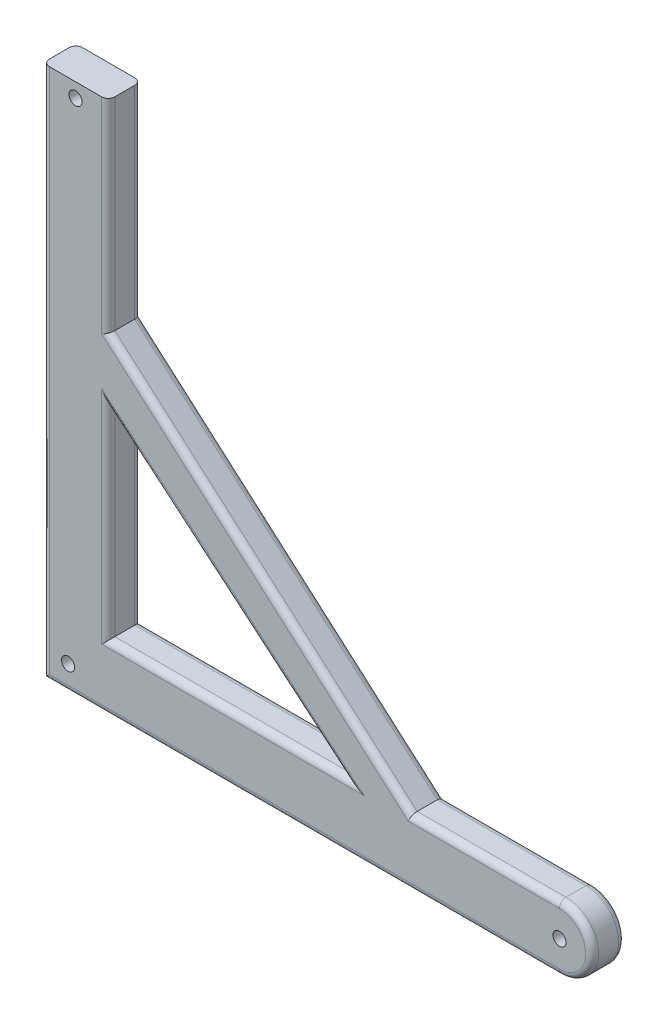
ISO-10303-21;
HEADER;
FILE_DESCRIPTION(('STEP AP214'),'2;1');
FILE_NAME('part.step','',(''),(''),'','','');
FILE_SCHEMA(('AUTOMOTIVE_DESIGN { 1 0 10303 214 1 1 1 1 }'));
ENDSEC;
DATA;
#1=APPLICATION_CONTEXT('core data for automotive mechanical design processes');
#2=APPLICATION_PROTOCOL_DEFINITION('international standard','automotive_design',2000,#1);
#3=PRODUCT_CONTEXT('',#1,'mechanical');
#4=PRODUCT('Part','Part','',(#3));
#5=PRODUCT_RELATED_PRODUCT_CATEGORY('part','',(#4));
#6=PRODUCT_DEFINITION_FORMATION('','',#4);
#7=PRODUCT_DEFINITION_CONTEXT('part definition',#1,'design');
#8=PRODUCT_DEFINITION('design','',#6,#7);
#9=PRODUCT_DEFINITION_SHAPE('','',#8);
#10=(LENGTH_UNIT() NAMED_UNIT(*) SI_UNIT(.MILLI.,.METRE.));
#11=(NAMED_UNIT(*) PLANE_ANGLE_UNIT() SI_UNIT($,.RADIAN.));
#12=(NAMED_UNIT(*) SI_UNIT($,.STERADIAN.) SOLID_ANGLE_UNIT());
#13=UNCERTAINTY_MEASURE_WITH_UNIT(LENGTH_MEASURE(1.E-05),#10,'distance_accuracy_value','');
#14=(GEOMETRIC_REPRESENTATION_CONTEXT(3) GLOBAL_UNCERTAINTY_ASSIGNED_CONTEXT((#13)) GLOBAL_UNIT_ASSIGNED_CONTEXT((#10,
#11,#12)) REPRESENTATION_CONTEXT('',''));
#15=CARTESIAN_POINT('',(0.,0.,0.));
#16=DIRECTION('',(0.,0.,1.));
#17=DIRECTION('',(1.,0.,0.));
#18=AXIS2_PLACEMENT_3D('',#15,#16,#17);
#19=CARTESIAN_POINT('',(130.379626457664,-10.,10.1));
#20=DIRECTION('',(0.,0.,-1.));
#21=DIRECTION('',(-1.,0.,0.));
#22=AXIS2_PLACEMENT_3D('',#19,#20,#21);
#23=CYLINDRICAL_SURFACE('',#22,10.);
#24=DIRECTION('',(0.,0.,-1.));
#25=VECTOR('',#24,1.);
#26=CARTESIAN_POINT('',(130.379626457664,-20.,10.1));
#27=LINE('',#26,#25);
#28=CARTESIAN_POINT('',(130.379626457664,-20.,8.1));
#29=VERTEX_POINT('',#28);
#30=CARTESIAN_POINT('',(130.379626457664,-20.,2.));
#31=VERTEX_POINT('',#30);
#32=EDGE_CURVE('E206',#29,#31,#27,.T.);
#33=ORIENTED_EDGE('',*,*,#32,.T.);
#34=CARTESIAN_POINT('',(130.379626457664,-10.,2.));
#35=DIRECTION('',(0.,0.,1.));
#36=DIRECTION('',(1.,0.,0.));
#37=AXIS2_PLACEMENT_3D('',#34,#35,#36);
#38=CIRCLE('',#37,10.);
#39=CARTESIAN_POINT('',(130.379626457664,0.,2.));
#40=VERTEX_POINT('',#39);
#41=EDGE_CURVE('E204',#31,#40,#38,.T.);
#42=ORIENTED_EDGE('',*,*,#41,.T.);
#43=DIRECTION('',(0.,0.,-1.));
#44=VECTOR('',#43,1.);
#45=CARTESIAN_POINT('',(130.379626457664,0.,10.1));
#46=LINE('',#45,#44);
#47=CARTESIAN_POINT('',(130.379626457664,0.,8.1));
#48=VERTEX_POINT('',#47);
#49=EDGE_CURVE('E188',#48,#40,#46,.T.);
#50=ORIENTED_EDGE('',*,*,#49,.F.);
#51=CARTESIAN_POINT('',(130.379626457664,-10.,8.1));
#52=DIRECTION('',(0.,0.,1.));
#53=DIRECTION('',(1.,0.,0.));
#54=AXIS2_PLACEMENT_3D('',#51,#52,#53);
#55=CIRCLE('',#54,10.);
#56=EDGE_CURVE('E201',#48,#29,#55,.F.);
#57=ORIENTED_EDGE('',*,*,#56,.T.);
#58=EDGE_LOOP('',(#33,#42,#50,#57));
#59=FACE_BOUND('',#58,.T.);
#60=ADVANCED_FACE('F47',(#59),#23,.T.);
#61=CARTESIAN_POINT('',(84.8796264576637,0.,10.1));
#62=DIRECTION('',(0.,-1.,0.));
#63=DIRECTION('',(0.,0.,-1.));
#64=AXIS2_PLACEMENT_3D('',#61,#62,#63);
#65=PLANE('',#64);
#66=ORIENTED_EDGE('',*,*,#49,.T.);
#67=DIRECTION('',(-1.,0.,0.));
#68=VECTOR('',#67,1.);
#69=CARTESIAN_POINT('',(84.8796264576637,0.,2.));
#70=LINE('',#69,#68);
#71=CARTESIAN_POINT('',(84.8796264576637,0.,2.));
#72=VERTEX_POINT('',#71);
#73=EDGE_CURVE('E65',#40,#72,#70,.T.);
#74=ORIENTED_EDGE('',*,*,#73,.T.);
#75=DIRECTION('',(0.,0.,-1.));
#76=VECTOR('',#75,1.);
#77=CARTESIAN_POINT('',(84.8796264576637,0.,10.1));
#78=LINE('',#77,#76);
#79=CARTESIAN_POINT('',(84.8796264576637,0.,8.1));
#80=VERTEX_POINT('',#79);
#81=EDGE_CURVE('E189',#80,#72,#78,.T.);
#82=ORIENTED_EDGE('',*,*,#81,.F.);
#83=DIRECTION('',(-1.,0.,0.));
#84=VECTOR('',#83,1.);
#85=CARTESIAN_POINT('',(130.379626457664,0.,8.1));
#86=LINE('',#85,#84);
#87=EDGE_CURVE('E185',#80,#48,#86,.F.);
#88=ORIENTED_EDGE('',*,*,#87,.T.);
#89=EDGE_LOOP('',(#66,#74,#82,#88));
#90=FACE_BOUND('',#89,.T.);
#91=ADVANCED_FACE('F187',(#90),#65,.F.);
#92=CARTESIAN_POINT('',(-7.62037354233634,81.0724984196244,10.1));
#93=DIRECTION('',(-0.659126003411581,-0.752032520325203,0.));
#94=DIRECTION('',(0.752032520325203,-0.659126003411581,0.));
#95=AXIS2_PLACEMENT_3D('',#92,#93,#94);
#96=PLANE('',#95);
#97=ORIENTED_EDGE('',*,*,#81,.T.);
#98=DIRECTION('',(-0.752032520325203,0.659126003411581,0.));
#99=VECTOR('',#98,1.);
#100=CARTESIAN_POINT('',(-7.62037354233634,81.0724984196244,2.));
#101=LINE('',#100,#99);
#102=CARTESIAN_POINT('',(-7.62037354233634,81.0724984196244,2.));
#103=VERTEX_POINT('',#102);
#104=EDGE_CURVE('E11',#72,#103,#101,.T.);
#105=ORIENTED_EDGE('',*,*,#104,.T.);
#106=DIRECTION('',(0.,0.,-1.));
#107=VECTOR('',#106,1.);
#108=CARTESIAN_POINT('',(-7.62037354233634,81.0724984196244,10.1));
#109=LINE('',#108,#107);
#110=CARTESIAN_POINT('',(-7.62037354233634,81.0724984196244,8.1));
#111=VERTEX_POINT('',#110);
#112=EDGE_CURVE('E421',#111,#103,#109,.T.);
#113=ORIENTED_EDGE('',*,*,#112,.F.);
#114=DIRECTION('',(-0.752032520325203,0.659126003411581,0.));
#115=VECTOR('',#114,1.);
#116=CARTESIAN_POINT('',(84.8796264576636,0.,8.1));
#117=LINE('',#116,#115);
#118=EDGE_CURVE('E57',#111,#80,#117,.F.);
#119=ORIENTED_EDGE('',*,*,#118,.T.);
#120=EDGE_LOOP('',(#97,#105,#113,#119));
#121=FACE_BOUND('',#120,.T.);
#122=ADVANCED_FACE('F499',(#121),#96,.F.);
#123=CARTESIAN_POINT('',(-7.62037354233634,81.0724984196244,10.1));
#124=DIRECTION('',(-1.,0.,0.));
#125=DIRECTION('',(0.,-1.,0.));
#126=AXIS2_PLACEMENT_3D('',#123,#124,#125);
#127=PLANE('',#126);
#128=ORIENTED_EDGE('',*,*,#112,.T.);
#129=DIRECTION('',(0.,1.,0.));
#130=VECTOR('',#129,1.);
#131=CARTESIAN_POINT('',(-7.62037354233634,81.0724984196244,2.));
#132=LINE('',#131,#130);
#133=CARTESIAN_POINT('',(-7.62037354233634,143.,2.));
#134=VERTEX_POINT('',#133);
#135=EDGE_CURVE('E318',#103,#134,#132,.T.);
#136=ORIENTED_EDGE('',*,*,#135,.T.);
#137=DIRECTION('',(0.,0.,-1.));
#138=VECTOR('',#137,1.);
#139=CARTESIAN_POINT('',(-7.62037354233634,143.,10.1));
#140=LINE('',#139,#138);
#141=CARTESIAN_POINT('',(-7.62037354233634,143.,8.1));
#142=VERTEX_POINT('',#141);
#143=EDGE_CURVE('E417',#142,#134,#140,.T.);
#144=ORIENTED_EDGE('',*,*,#143,.F.);
#145=DIRECTION('',(0.,1.,0.));
#146=VECTOR('',#145,1.);
#147=CARTESIAN_POINT('',(-7.62037354233634,81.0724984196244,8.1));
#148=LINE('',#147,#146);
#149=EDGE_CURVE('E315',#142,#111,#148,.F.);
#150=ORIENTED_EDGE('',*,*,#149,.T.);
#151=EDGE_LOOP('',(#128,#136,#144,#150));
#152=FACE_BOUND('',#151,.T.);
#153=ADVANCED_FACE('F738',(#152),#127,.F.);
#154=CARTESIAN_POINT('',(-7.62037354233634,143.,10.1));
#155=DIRECTION('',(0.,-1.,0.));
#156=DIRECTION('',(0.,0.,-1.));
#157=AXIS2_PLACEMENT_3D('',#154,#155,#156);
#158=PLANE('',#157);
#159=ORIENTED_EDGE('',*,*,#143,.T.);
#160=CARTESIAN_POINT('',(-9.62037354233634,143.,2.));
#161=DIRECTION('',(0.,-1.,0.));
#162=DIRECTION('',(0.,0.,-1.));
#163=AXIS2_PLACEMENT_3D('',#160,#161,#162);
#164=CIRCLE('',#163,2.);
#165=CARTESIAN_POINT('',(-9.62037354233634,143.,0.));
#166=VERTEX_POINT('',#165);
#167=EDGE_CURVE('E330',#134,#166,#164,.F.);
#168=ORIENTED_EDGE('',*,*,#167,.T.);
#169=DIRECTION('',(-1.,0.,0.));
#170=VECTOR('',#169,1.);
#171=CARTESIAN_POINT('',(-7.62037354233634,143.,0.));
#172=LINE('',#171,#170);
#173=CARTESIAN_POINT('',(-25.6203735423363,143.,0.));
#174=VERTEX_POINT('',#173);
#175=EDGE_CURVE('E406',#166,#174,#172,.T.);
#176=ORIENTED_EDGE('',*,*,#175,.T.);
#177=CARTESIAN_POINT('',(-25.6203735423363,143.,2.));
#178=DIRECTION('',(0.,-1.,0.));
#179=DIRECTION('',(0.,0.,-1.));
#180=AXIS2_PLACEMENT_3D('',#177,#178,#179);
#181=CIRCLE('',#180,2.);
#182=CARTESIAN_POINT('',(-27.6203735423363,143.,2.));
#183=VERTEX_POINT('',#182);
#184=EDGE_CURVE('E321',#174,#183,#181,.F.);
#185=ORIENTED_EDGE('',*,*,#184,.T.);
#186=DIRECTION('',(0.,0.,-1.));
#187=VECTOR('',#186,1.);
#188=CARTESIAN_POINT('',(-27.6203735423363,143.,10.1));
#189=LINE('',#188,#187);
#190=CARTESIAN_POINT('',(-27.6203735423363,143.,8.1));
#191=VERTEX_POINT('',#190);
#192=EDGE_CURVE('E413',#191,#183,#189,.T.);
#193=ORIENTED_EDGE('',*,*,#192,.F.);
#194=CARTESIAN_POINT('',(-25.6203735423363,143.,8.1));
#195=DIRECTION('',(0.,-1.,0.));
#196=DIRECTION('',(0.,0.,-1.));
#197=AXIS2_PLACEMENT_3D('',#194,#195,#196);
#198=CIRCLE('',#197,2.);
#199=CARTESIAN_POINT('',(-25.6203735423363,143.,10.1));
#200=VERTEX_POINT('',#199);
#201=EDGE_CURVE('E324',#191,#200,#198,.F.);
#202=ORIENTED_EDGE('',*,*,#201,.T.);
#203=DIRECTION('',(-1.,0.,0.));
#204=VECTOR('',#203,1.);
#205=CARTESIAN_POINT('',(-7.62037354233634,143.,10.1));
#206=LINE('',#205,#204);
#207=CARTESIAN_POINT('',(-9.62037354233632,143.,10.1));
#208=VERTEX_POINT('',#207);
#209=EDGE_CURVE('E401',#208,#200,#206,.T.);
#210=ORIENTED_EDGE('',*,*,#209,.F.);
#211=CARTESIAN_POINT('',(-9.62037354233632,143.,8.1));
#212=DIRECTION('',(0.,-1.,0.));
#213=DIRECTION('',(0.,0.,-1.));
#214=AXIS2_PLACEMENT_3D('',#211,#212,#213);
#215=CIRCLE('',#214,2.);
#216=EDGE_CURVE('E327',#208,#142,#215,.F.);
#217=ORIENTED_EDGE('',*,*,#216,.T.);
#218=EDGE_LOOP('',(#159,#168,#176,#185,#193,#202,#210,#217));
#219=FACE_BOUND('',#218,.T.);
#220=ADVANCED_FACE('F454',(#219),#158,.F.);
#221=CARTESIAN_POINT('',(-27.6203735423363,-20.,10.1));
#222=DIRECTION('',(1.,0.,0.));
#223=DIRECTION('',(0.,0.,-1.));
#224=AXIS2_PLACEMENT_3D('',#221,#222,#223);
#225=PLANE('',#224);
#226=DIRECTION('',(0.,0.,-1.));
#227=VECTOR('',#226,1.);
#228=CARTESIAN_POINT('',(-27.6203735423363,-20.,10.1));
#229=LINE('',#228,#227);
#230=CARTESIAN_POINT('',(-27.6203735423363,-20.,8.1));
#231=VERTEX_POINT('',#230);
#232=CARTESIAN_POINT('',(-27.6203735423363,-20.,2.));
#233=VERTEX_POINT('',#232);
#234=EDGE_CURVE('E405',#231,#233,#229,.T.);
#235=ORIENTED_EDGE('',*,*,#234,.F.);
#236=DIRECTION('',(0.,-1.,0.));
#237=VECTOR('',#236,1.);
#238=CARTESIAN_POINT('',(-27.6203735423363,143.,8.1));
#239=LINE('',#238,#237);
#240=EDGE_CURVE('E336',#231,#191,#239,.F.);
#241=ORIENTED_EDGE('',*,*,#240,.T.);
#242=ORIENTED_EDGE('',*,*,#192,.T.);
#243=DIRECTION('',(0.,-1.,0.));
#244=VECTOR('',#243,1.);
#245=CARTESIAN_POINT('',(-27.6203735423363,-20.,2.));
#246=LINE('',#245,#244);
#247=EDGE_CURVE('E333',#183,#233,#246,.T.);
#248=ORIENTED_EDGE('',*,*,#247,.T.);
#249=EDGE_LOOP('',(#235,#241,#242,#248));
#250=FACE_BOUND('',#249,.T.);
#251=ADVANCED_FACE('F461',(#250),#225,.F.);
#252=CARTESIAN_POINT('',(84.8796264576637,-20.,10.1));
#253=DIRECTION('',(0.,1.,0.));
#254=DIRECTION('',(-1.,0.,0.));
#255=AXIS2_PLACEMENT_3D('',#252,#253,#254);
#256=PLANE('',#255);
#257=ORIENTED_EDGE('',*,*,#234,.T.);
#258=DIRECTION('',(1.,0.,0.));
#259=VECTOR('',#258,1.);
#260=CARTESIAN_POINT('',(84.8796264576637,-20.,2.));
#261=LINE('',#260,#259);
#262=EDGE_CURVE('E342',#233,#31,#261,.T.);
#263=ORIENTED_EDGE('',*,*,#262,.T.);
#264=ORIENTED_EDGE('',*,*,#32,.F.);
#265=DIRECTION('',(1.,0.,0.));
#266=VECTOR('',#265,1.);
#267=CARTESIAN_POINT('',(-27.6203735423363,-20.,8.1));
#268=LINE('',#267,#266);
#269=EDGE_CURVE('E339',#29,#231,#268,.F.);
#270=ORIENTED_EDGE('',*,*,#269,.T.);
#271=EDGE_LOOP('',(#257,#263,#264,#270));
#272=FACE_BOUND('',#271,.T.);
#273=ADVANCED_FACE('F464',(#272),#256,.F.);
#274=CARTESIAN_POINT('',(130.379626457664,-10.,10.1));
#275=DIRECTION('',(0.,0.,1.));
#276=DIRECTION('',(1.,0.,0.));
#277=AXIS2_PLACEMENT_3D('',#274,#275,#276);
#278=PLANE('',#277);
#279=CARTESIAN_POINT('',(130.379626457664,-10.,10.1));
#280=DIRECTION('',(0.,0.,1.));
#281=DIRECTION('',(1.,0.,0.));
#282=AXIS2_PLACEMENT_3D('',#279,#280,#281);
#283=CIRCLE('',#282,2.);
#284=CARTESIAN_POINT('',(132.379626457664,-10.,10.1));
#285=VERTEX_POINT('',#284);
#286=EDGE_CURVE('E813',#285,#285,#283,.T.);
#287=ORIENTED_EDGE('',*,*,#286,.F.);
#288=EDGE_LOOP('',(#287));
#289=FACE_BOUND('',#288,.T.);
#290=CARTESIAN_POINT('',(-19.903008844991,-12.2826353026546,10.1));
#291=DIRECTION('',(0.,0.,1.));
#292=DIRECTION('',(1.,0.,0.));
#293=AXIS2_PLACEMENT_3D('',#290,#291,#292);
#294=CIRCLE('',#293,2.);
#295=CARTESIAN_POINT('',(-17.9030088449909,-12.2826353026546,10.1));
#296=VERTEX_POINT('',#295);
#297=EDGE_CURVE('E809',#296,#296,#294,.T.);
#298=ORIENTED_EDGE('',*,*,#297,.F.);
#299=EDGE_LOOP('',(#298));
#300=FACE_BOUND('',#299,.T.);
#301=CARTESIAN_POINT('',(-17.6203735423363,138.6375916414,10.1));
#302=DIRECTION('',(0.,0.,1.));
#303=DIRECTION('',(1.,0.,0.));
#304=AXIS2_PLACEMENT_3D('',#301,#302,#303);
#305=CIRCLE('',#304,2.);
#306=CARTESIAN_POINT('',(-15.6203735423363,138.6375916414,10.1));
#307=VERTEX_POINT('',#306);
#308=EDGE_CURVE('E801',#307,#307,#305,.T.);
#309=ORIENTED_EDGE('',*,*,#308,.F.);
#310=EDGE_LOOP('',(#309));
#311=FACE_BOUND('',#310,.T.);
#312=DIRECTION('',(0.,-1.,0.));
#313=VECTOR('',#312,1.);
#314=CARTESIAN_POINT('',(-9.62037354233634,61.4624984196244,10.1));
#315=LINE('',#314,#313);
#316=CARTESIAN_POINT('',(-9.62037354233633,-2.,10.1));
#317=VERTEX_POINT('',#316);
#318=CARTESIAN_POINT('',(-9.62037354233634,65.7650663510499,10.1));
#319=VERTEX_POINT('',#318);
#320=EDGE_CURVE('E305',#317,#319,#315,.F.);
#321=ORIENTED_EDGE('',*,*,#320,.T.);
#322=DIRECTION('',(0.764490152209144,-0.644635406392823,0.));
#323=VECTOR('',#322,1.);
#324=CARTESIAN_POINT('',(109.540297974796,-34.7139099804514,10.1));
#325=LINE('',#324,#323);
#326=CARTESIAN_POINT('',(70.7440082080632,-2.,10.1));
#327=VERTEX_POINT('',#326);
#328=EDGE_CURVE('E311',#319,#327,#325,.T.);
#329=ORIENTED_EDGE('',*,*,#328,.T.);
#330=DIRECTION('',(1.,0.,0.));
#331=VECTOR('',#330,1.);
#332=CARTESIAN_POINT('',(-7.62037354233633,-2.,10.1));
#333=LINE('',#332,#331);
#334=EDGE_CURVE('E308',#327,#317,#333,.F.);
#335=ORIENTED_EDGE('',*,*,#334,.T.);
#336=EDGE_LOOP('',(#321,#329,#335));
#337=FACE_BOUND('',#336,.T.);
#338=ORIENTED_EDGE('',*,*,#209,.T.);
#339=DIRECTION('',(0.,-1.,0.));
#340=VECTOR('',#339,1.);
#341=CARTESIAN_POINT('',(-25.6203735423363,-20.,10.1));
#342=LINE('',#341,#340);
#343=CARTESIAN_POINT('',(-25.6203735423363,-18.,10.1));
#344=VERTEX_POINT('',#343);
#345=EDGE_CURVE('E302',#200,#344,#342,.T.);
#346=ORIENTED_EDGE('',*,*,#345,.T.);
#347=DIRECTION('',(1.,0.,0.));
#348=VECTOR('',#347,1.);
#349=CARTESIAN_POINT('',(130.379626457664,-18.,10.1));
#350=LINE('',#349,#348);
#351=CARTESIAN_POINT('',(130.379626457664,-18.,10.1));
#352=VERTEX_POINT('',#351);
#353=EDGE_CURVE('E299',#344,#352,#350,.T.);
#354=ORIENTED_EDGE('',*,*,#353,.T.);
#355=CARTESIAN_POINT('',(130.379626457664,-10.,10.1));
#356=DIRECTION('',(0.,0.,1.));
#357=DIRECTION('',(1.,0.,0.));
#358=AXIS2_PLACEMENT_3D('',#355,#356,#357);
#359=CIRCLE('',#358,8.);
#360=CARTESIAN_POINT('',(130.379626457664,-2.,10.1));
#361=VERTEX_POINT('',#360);
#362=EDGE_CURVE('E296',#352,#361,#359,.T.);
#363=ORIENTED_EDGE('',*,*,#362,.T.);
#364=DIRECTION('',(-1.,0.,0.));
#365=VECTOR('',#364,1.);
#366=CARTESIAN_POINT('',(84.8796264576637,-2.,10.1));
#367=LINE('',#366,#365);
#368=CARTESIAN_POINT('',(84.1272134792912,-2.,10.1));
#369=VERTEX_POINT('',#368);
#370=EDGE_CURVE('E219',#361,#369,#367,.T.);
#371=ORIENTED_EDGE('',*,*,#370,.T.);
#372=DIRECTION('',(-0.752032520325203,0.659126003411581,0.));
#373=VECTOR('',#372,1.);
#374=CARTESIAN_POINT('',(-8.93862554915954,79.568433378974,10.1));
#375=LINE('',#374,#373);
#376=CARTESIAN_POINT('',(-9.62037354233632,80.1659578449135,10.1));
#377=VERTEX_POINT('',#376);
#378=EDGE_CURVE('E283',#369,#377,#375,.T.);
#379=ORIENTED_EDGE('',*,*,#378,.T.);
#380=DIRECTION('',(0.,1.,0.));
#381=VECTOR('',#380,1.);
#382=CARTESIAN_POINT('',(-9.62037354233632,143.,10.1));
#383=LINE('',#382,#381);
#384=EDGE_CURVE('E293',#377,#208,#383,.T.);
#385=ORIENTED_EDGE('',*,*,#384,.T.);
#386=EDGE_LOOP('',(#338,#346,#354,#363,#371,#379,#385));
#387=FACE_BOUND('',#386,.T.);
#388=ADVANCED_FACE('F477',(#289,#300,#311,#337,#387),#278,.T.);
#389=CARTESIAN_POINT('',(130.379626457664,-10.,0.));
#390=DIRECTION('',(0.,0.,1.));
#391=DIRECTION('',(1.,0.,0.));
#392=AXIS2_PLACEMENT_3D('',#389,#390,#391);
#393=PLANE('',#392);
#394=CARTESIAN_POINT('',(130.379626457664,-10.,0.));
#395=DIRECTION('',(0.,0.,1.));
#396=DIRECTION('',(1.,0.,0.));
#397=AXIS2_PLACEMENT_3D('',#394,#395,#396);
#398=CIRCLE('',#397,2.);
#399=CARTESIAN_POINT('',(132.379626457664,-10.,0.));
#400=VERTEX_POINT('',#399);
#401=EDGE_CURVE('E254',#400,#400,#398,.T.);
#402=ORIENTED_EDGE('',*,*,#401,.T.);
#403=EDGE_LOOP('',(#402));
#404=FACE_BOUND('',#403,.T.);
#405=CARTESIAN_POINT('',(-19.903008844991,-12.2826353026546,0.));
#406=DIRECTION('',(0.,0.,1.));
#407=DIRECTION('',(1.,0.,0.));
#408=AXIS2_PLACEMENT_3D('',#405,#406,#407);
#409=CIRCLE('',#408,2.);
#410=CARTESIAN_POINT('',(-17.9030088449909,-12.2826353026546,0.));
#411=VERTEX_POINT('',#410);
#412=EDGE_CURVE('E805',#411,#411,#409,.T.);
#413=ORIENTED_EDGE('',*,*,#412,.T.);
#414=EDGE_LOOP('',(#413));
#415=FACE_BOUND('',#414,.T.);
#416=CARTESIAN_POINT('',(-17.6203735423363,138.6375916414,0.));
#417=DIRECTION('',(0.,0.,1.));
#418=DIRECTION('',(1.,0.,0.));
#419=AXIS2_PLACEMENT_3D('',#416,#417,#418);
#420=CIRCLE('',#419,2.);
#421=CARTESIAN_POINT('',(-15.6203735423363,138.6375916414,0.));
#422=VERTEX_POINT('',#421);
#423=EDGE_CURVE('E797',#422,#422,#420,.T.);
#424=ORIENTED_EDGE('',*,*,#423,.T.);
#425=EDGE_LOOP('',(#424));
#426=FACE_BOUND('',#425,.T.);
#427=DIRECTION('',(0.764490152209144,-0.644635406392823,0.));
#428=VECTOR('',#427,1.);
#429=CARTESIAN_POINT('',(-6.33110272955069,62.9914787240427,0.));
#430=LINE('',#429,#428);
#431=CARTESIAN_POINT('',(70.7440082080632,-2.,0.));
#432=VERTEX_POINT('',#431);
#433=CARTESIAN_POINT('',(-9.62037354233634,65.7650663510499,0.));
#434=VERTEX_POINT('',#433);
#435=EDGE_CURVE('E276',#432,#434,#430,.F.);
#436=ORIENTED_EDGE('',*,*,#435,.T.);
#437=DIRECTION('',(0.,-1.,0.));
#438=VECTOR('',#437,1.);
#439=CARTESIAN_POINT('',(-9.62037354233633,-10.,0.));
#440=LINE('',#439,#438);
#441=CARTESIAN_POINT('',(-9.62037354233633,-2.,0.));
#442=VERTEX_POINT('',#441);
#443=EDGE_CURVE('E279',#434,#442,#440,.T.);
#444=ORIENTED_EDGE('',*,*,#443,.T.);
#445=DIRECTION('',(1.,0.,0.));
#446=VECTOR('',#445,1.);
#447=CARTESIAN_POINT('',(130.379626457664,-2.,0.));
#448=LINE('',#447,#446);
#449=EDGE_CURVE('E269',#442,#432,#448,.T.);
#450=ORIENTED_EDGE('',*,*,#449,.T.);
#451=EDGE_LOOP('',(#436,#444,#450));
#452=FACE_BOUND('',#451,.T.);
#453=DIRECTION('',(1.,0.,0.));
#454=VECTOR('',#453,1.);
#455=CARTESIAN_POINT('',(130.379626457664,-18.,0.));
#456=LINE('',#455,#454);
#457=CARTESIAN_POINT('',(130.379626457664,-18.,0.));
#458=VERTEX_POINT('',#457);
#459=CARTESIAN_POINT('',(-25.6203735423363,-18.,0.));
#460=VERTEX_POINT('',#459);
#461=EDGE_CURVE('E443',#458,#460,#456,.F.);
#462=ORIENTED_EDGE('',*,*,#461,.T.);
#463=DIRECTION('',(0.,-1.,0.));
#464=VECTOR('',#463,1.);
#465=CARTESIAN_POINT('',(-25.6203735423363,-10.,0.));
#466=LINE('',#465,#464);
#467=EDGE_CURVE('E285',#460,#174,#466,.F.);
#468=ORIENTED_EDGE('',*,*,#467,.T.);
#469=ORIENTED_EDGE('',*,*,#175,.F.);
#470=DIRECTION('',(0.,1.,0.));
#471=VECTOR('',#470,1.);
#472=CARTESIAN_POINT('',(-9.62037354233633,-9.99999999999999,0.));
#473=LINE('',#472,#471);
#474=CARTESIAN_POINT('',(-9.62037354233634,80.1659578449136,0.));
#475=VERTEX_POINT('',#474);
#476=EDGE_CURVE('E437',#166,#475,#473,.F.);
#477=ORIENTED_EDGE('',*,*,#476,.T.);
#478=DIRECTION('',(-0.752032520325203,0.659126003411581,0.));
#479=VECTOR('',#478,1.);
#480=CARTESIAN_POINT('',(114.250873825429,-28.4021665492494,0.));
#481=LINE('',#480,#479);
#482=CARTESIAN_POINT('',(84.1272134792913,-2.,0.));
#483=VERTEX_POINT('',#482);
#484=EDGE_CURVE('E431',#475,#483,#481,.F.);
#485=ORIENTED_EDGE('',*,*,#484,.T.);
#486=DIRECTION('',(-1.,0.,0.));
#487=VECTOR('',#486,1.);
#488=CARTESIAN_POINT('',(130.379626457664,-2.,0.));
#489=LINE('',#488,#487);
#490=CARTESIAN_POINT('',(130.379626457664,-2.,0.));
#491=VERTEX_POINT('',#490);
#492=EDGE_CURVE('E434',#483,#491,#489,.F.);
#493=ORIENTED_EDGE('',*,*,#492,.T.);
#494=CARTESIAN_POINT('',(130.379626457664,-10.,0.));
#495=DIRECTION('',(0.,0.,1.));
#496=DIRECTION('',(1.,0.,0.));
#497=AXIS2_PLACEMENT_3D('',#494,#495,#496);
#498=CIRCLE('',#497,8.);
#499=EDGE_CURVE('E440',#491,#458,#498,.F.);
#500=ORIENTED_EDGE('',*,*,#499,.T.);
#501=EDGE_LOOP('',(#462,#468,#469,#477,#485,#493,#500));
#502=FACE_BOUND('',#501,.T.);
#503=ADVANCED_FACE('F449',(#404,#415,#426,#452,#502),#393,.F.);
#504=CARTESIAN_POINT('',(-7.62037354233634,61.4624984196244,0.));
#505=DIRECTION('',(-1.,0.,0.));
#506=DIRECTION('',(0.,-1.,0.));
#507=AXIS2_PLACEMENT_3D('',#504,#505,#506);
#508=PLANE('',#507);
#509=DIRECTION('',(0.,0.,1.));
#510=VECTOR('',#509,1.);
#511=CARTESIAN_POINT('',(-7.62037354233634,61.4624984196244,0.));
#512=LINE('',#511,#510);
#513=CARTESIAN_POINT('',(-7.62037354233634,61.4624984196244,2.));
#514=VERTEX_POINT('',#513);
#515=CARTESIAN_POINT('',(-7.62037354233634,61.4624984196244,8.1));
#516=VERTEX_POINT('',#515);
#517=EDGE_CURVE('E397',#514,#516,#512,.T.);
#518=ORIENTED_EDGE('',*,*,#517,.T.);
#519=DIRECTION('',(0.,-1.,0.));
#520=VECTOR('',#519,1.);
#521=CARTESIAN_POINT('',(-7.62037354233633,0.,8.1));
#522=LINE('',#521,#520);
#523=CARTESIAN_POINT('',(-7.62037354233633,0.,8.1));
#524=VERTEX_POINT('',#523);
#525=EDGE_CURVE('E195',#516,#524,#522,.T.);
#526=ORIENTED_EDGE('',*,*,#525,.T.);
#527=DIRECTION('',(0.,0.,1.));
#528=VECTOR('',#527,1.);
#529=CARTESIAN_POINT('',(-7.62037354233633,0.,0.));
#530=LINE('',#529,#528);
#531=CARTESIAN_POINT('',(-7.62037354233633,0.,2.));
#532=VERTEX_POINT('',#531);
#533=EDGE_CURVE('E383',#532,#524,#530,.T.);
#534=ORIENTED_EDGE('',*,*,#533,.F.);
#535=DIRECTION('',(0.,-1.,0.));
#536=VECTOR('',#535,1.);
#537=CARTESIAN_POINT('',(-7.62037354233634,61.4624984196244,2.));
#538=LINE('',#537,#536);
#539=EDGE_CURVE('E356',#532,#514,#538,.F.);
#540=ORIENTED_EDGE('',*,*,#539,.T.);
#541=EDGE_LOOP('',(#518,#526,#534,#540));
#542=FACE_BOUND('',#541,.T.);
#543=ADVANCED_FACE('F601',(#542),#508,.F.);
#544=CARTESIAN_POINT('',(-7.62037354233634,61.4624984196244,0.));
#545=DIRECTION('',(-0.644635406392823,-0.764490152209144,0.));
#546=DIRECTION('',(0.764490152209144,-0.644635406392823,0.));
#547=AXIS2_PLACEMENT_3D('',#544,#545,#546);
#548=PLANE('',#547);
#549=DIRECTION('',(0.,0.,1.));
#550=VECTOR('',#549,1.);
#551=CARTESIAN_POINT('',(65.2696264576636,0.,0.));
#552=LINE('',#551,#550);
#553=CARTESIAN_POINT('',(65.2696264576636,0.,2.));
#554=VERTEX_POINT('',#553);
#555=CARTESIAN_POINT('',(65.2696264576636,0.,8.1));
#556=VERTEX_POINT('',#555);
#557=EDGE_CURVE('E390',#554,#556,#552,.T.);
#558=ORIENTED_EDGE('',*,*,#557,.T.);
#559=DIRECTION('',(0.764490152209144,-0.644635406392823,0.));
#560=VECTOR('',#559,1.);
#561=CARTESIAN_POINT('',(-7.62037354233634,61.4624984196244,8.1));
#562=LINE('',#561,#560);
#563=EDGE_CURVE('E347',#556,#516,#562,.F.);
#564=ORIENTED_EDGE('',*,*,#563,.T.);
#565=ORIENTED_EDGE('',*,*,#517,.F.);
#566=DIRECTION('',(0.764490152209144,-0.644635406392823,0.));
#567=VECTOR('',#566,1.);
#568=CARTESIAN_POINT('',(65.2696264576637,0.,2.));
#569=LINE('',#568,#567);
#570=EDGE_CURVE('E274',#514,#554,#569,.T.);
#571=ORIENTED_EDGE('',*,*,#570,.T.);
#572=EDGE_LOOP('',(#558,#564,#565,#571));
#573=FACE_BOUND('',#572,.T.);
#574=ADVANCED_FACE('F698',(#573),#548,.T.);
#575=CARTESIAN_POINT('',(-7.62037354233633,0.,0.));
#576=DIRECTION('',(0.,-1.,0.));
#577=DIRECTION('',(1.,0.,0.));
#578=AXIS2_PLACEMENT_3D('',#575,#576,#577);
#579=PLANE('',#578);
#580=ORIENTED_EDGE('',*,*,#533,.T.);
#581=DIRECTION('',(1.,0.,0.));
#582=VECTOR('',#581,1.);
#583=CARTESIAN_POINT('',(65.2696264576636,0.,8.1));
#584=LINE('',#583,#582);
#585=EDGE_CURVE('E353',#524,#556,#584,.T.);
#586=ORIENTED_EDGE('',*,*,#585,.T.);
#587=ORIENTED_EDGE('',*,*,#557,.F.);
#588=DIRECTION('',(1.,0.,0.));
#589=VECTOR('',#588,1.);
#590=CARTESIAN_POINT('',(-7.62037354233633,0.,2.));
#591=LINE('',#590,#589);
#592=EDGE_CURVE('E271',#554,#532,#591,.F.);
#593=ORIENTED_EDGE('',*,*,#592,.T.);
#594=EDGE_LOOP('',(#580,#586,#587,#593));
#595=FACE_BOUND('',#594,.T.);
#596=ADVANCED_FACE('F522',(#595),#579,.F.);
#597=CARTESIAN_POINT('',(-9.62037354233634,81.0724984196244,2.));
#598=DIRECTION('',(0.,1.,0.));
#599=DIRECTION('',(-1.,0.,0.));
#600=AXIS2_PLACEMENT_3D('',#597,#598,#599);
#601=CYLINDRICAL_SURFACE('',#600,2.);
#602=ORIENTED_EDGE('',*,*,#167,.F.);
#603=ORIENTED_EDGE('',*,*,#135,.F.);
#604=CARTESIAN_POINT('',(-9.62037354233634,80.1659578449136,2.));
#605=DIRECTION('',(-0.412840160708972,0.910803492365829,0.));
#606=DIRECTION('',(0.910803492365829,0.412840160708972,0.));
#607=AXIS2_PLACEMENT_3D('',#604,#605,#606);
#608=ELLIPSE('',#607,2.19586334128448,2.);
#609=EDGE_CURVE('E232',#475,#103,#608,.F.);
#610=ORIENTED_EDGE('',*,*,#609,.F.);
#611=ORIENTED_EDGE('',*,*,#476,.F.);
#612=EDGE_LOOP('',(#602,#603,#610,#611));
#613=FACE_BOUND('',#612,.T.);
#614=ADVANCED_FACE('F519',(#613),#601,.T.);
#615=CARTESIAN_POINT('',(-25.6203735423363,-20.,2.));
#616=DIRECTION('',(0.,-1.,0.));
#617=DIRECTION('',(0.,0.,-1.));
#618=AXIS2_PLACEMENT_3D('',#615,#616,#617);
#619=CYLINDRICAL_SURFACE('',#618,2.);
#620=ORIENTED_EDGE('',*,*,#184,.F.);
#621=ORIENTED_EDGE('',*,*,#467,.F.);
#622=CARTESIAN_POINT('',(-25.6203735423363,-18.,2.));
#623=DIRECTION('',(0.707106781186548,-0.707106781186547,0.));
#624=DIRECTION('',(0.707106781186547,0.707106781186548,0.));
#625=AXIS2_PLACEMENT_3D('',#622,#623,#624);
#626=ELLIPSE('',#625,2.82842712474619,2.);
#627=EDGE_CURVE('E374',#233,#460,#626,.T.);
#628=ORIENTED_EDGE('',*,*,#627,.F.);
#629=ORIENTED_EDGE('',*,*,#247,.F.);
#630=EDGE_LOOP('',(#620,#621,#628,#629));
#631=FACE_BOUND('',#630,.T.);
#632=ADVANCED_FACE('F458',(#631),#619,.T.);
#633=CARTESIAN_POINT('',(-8.9386255491595,79.568433378974,2.));
#634=DIRECTION('',(-0.752032520325203,0.659126003411581,0.));
#635=DIRECTION('',(-0.659126003411581,-0.752032520325203,0.));
#636=AXIS2_PLACEMENT_3D('',#633,#634,#635);
#637=CYLINDRICAL_SURFACE('',#636,2.);
#638=ORIENTED_EDGE('',*,*,#609,.T.);
#639=ORIENTED_EDGE('',*,*,#104,.F.);
#640=CARTESIAN_POINT('',(84.1272134792913,-2.00000000000002,2.));
#641=DIRECTION('',(-0.935957402963726,0.352113248596809,0.));
#642=DIRECTION('',(-0.352113248596809,-0.935957402963726,0.));
#643=AXIS2_PLACEMENT_3D('',#640,#641,#642);
#644=ELLIPSE('',#643,2.13684938402855,2.);
#645=EDGE_CURVE('E371',#483,#72,#644,.F.);
#646=ORIENTED_EDGE('',*,*,#645,.F.);
#647=ORIENTED_EDGE('',*,*,#484,.F.);
#648=EDGE_LOOP('',(#638,#639,#646,#647));
#649=FACE_BOUND('',#648,.T.);
#650=ADVANCED_FACE('F514',(#649),#637,.T.);
#651=CARTESIAN_POINT('',(84.8796264576637,-18.,2.));
#652=DIRECTION('',(1.,0.,0.));
#653=DIRECTION('',(0.,1.,0.));
#654=AXIS2_PLACEMENT_3D('',#651,#652,#653);
#655=CYLINDRICAL_SURFACE('',#654,2.);
#656=ORIENTED_EDGE('',*,*,#627,.T.);
#657=ORIENTED_EDGE('',*,*,#461,.F.);
#658=CARTESIAN_POINT('',(130.379626457664,-18.,2.));
#659=DIRECTION('',(1.,0.,0.));
#660=DIRECTION('',(0.,0.,-1.));
#661=AXIS2_PLACEMENT_3D('',#658,#659,#660);
#662=CIRCLE('',#661,2.);
#663=EDGE_CURVE('E367',#31,#458,#662,.T.);
#664=ORIENTED_EDGE('',*,*,#663,.F.);
#665=ORIENTED_EDGE('',*,*,#262,.F.);
#666=EDGE_LOOP('',(#656,#657,#664,#665));
#667=FACE_BOUND('',#666,.T.);
#668=ADVANCED_FACE('F510',(#667),#655,.T.);
#669=CARTESIAN_POINT('',(84.8796264576637,-2.,2.));
#670=DIRECTION('',(-1.,0.,0.));
#671=DIRECTION('',(0.,0.,1.));
#672=AXIS2_PLACEMENT_3D('',#669,#670,#671);
#673=CYLINDRICAL_SURFACE('',#672,2.);
#674=ORIENTED_EDGE('',*,*,#645,.T.);
#675=ORIENTED_EDGE('',*,*,#73,.F.);
#676=CARTESIAN_POINT('',(130.379626457664,-2.,2.));
#677=DIRECTION('',(1.,0.,0.));
#678=DIRECTION('',(0.,0.,-1.));
#679=AXIS2_PLACEMENT_3D('',#676,#677,#678);
#680=CIRCLE('',#679,2.);
#681=EDGE_CURVE('E245',#491,#40,#680,.T.);
#682=ORIENTED_EDGE('',*,*,#681,.F.);
#683=ORIENTED_EDGE('',*,*,#492,.F.);
#684=EDGE_LOOP('',(#674,#675,#682,#683));
#685=FACE_BOUND('',#684,.T.);
#686=ADVANCED_FACE('F506',(#685),#673,.T.);
#687=CARTESIAN_POINT('',(130.379626457664,-10.,2.));
#688=DIRECTION('',(0.,0.,1.));
#689=DIRECTION('',(1.,0.,0.));
#690=AXIS2_PLACEMENT_3D('',#687,#688,#689);
#691=TOROIDAL_SURFACE('',#690,8.,2.);
#692=ORIENTED_EDGE('',*,*,#663,.T.);
#693=ORIENTED_EDGE('',*,*,#499,.F.);
#694=ORIENTED_EDGE('',*,*,#681,.T.);
#695=ORIENTED_EDGE('',*,*,#41,.F.);
#696=EDGE_LOOP('',(#692,#693,#694,#695));
#697=FACE_BOUND('',#696,.T.);
#698=ADVANCED_FACE('F503',(#697),#691,.T.);
#699=CARTESIAN_POINT('',(-9.62037354233633,-9.99999999999999,8.1));
#700=DIRECTION('',(0.,-1.,0.));
#701=DIRECTION('',(1.,0.,0.));
#702=AXIS2_PLACEMENT_3D('',#699,#700,#701);
#703=CYLINDRICAL_SURFACE('',#702,2.);
#704=ORIENTED_EDGE('',*,*,#216,.F.);
#705=ORIENTED_EDGE('',*,*,#384,.F.);
#706=CARTESIAN_POINT('',(-9.62037354233633,80.1659578449135,8.1));
#707=DIRECTION('',(0.412840160708972,-0.910803492365829,0.));
#708=DIRECTION('',(-0.910803492365829,-0.412840160708972,0.));
#709=AXIS2_PLACEMENT_3D('',#706,#707,#708);
#710=ELLIPSE('',#709,2.19586334128448,2.);
#711=EDGE_CURVE('E241',#111,#377,#710,.T.);
#712=ORIENTED_EDGE('',*,*,#711,.F.);
#713=ORIENTED_EDGE('',*,*,#149,.F.);
#714=EDGE_LOOP('',(#704,#705,#712,#713));
#715=FACE_BOUND('',#714,.T.);
#716=ADVANCED_FACE('F482',(#715),#703,.T.);
#717=CARTESIAN_POINT('',(-25.6203735423363,-10.,8.1));
#718=DIRECTION('',(0.,1.,0.));
#719=DIRECTION('',(0.,0.,1.));
#720=AXIS2_PLACEMENT_3D('',#717,#718,#719);
#721=CYLINDRICAL_SURFACE('',#720,2.);
#722=ORIENTED_EDGE('',*,*,#201,.F.);
#723=ORIENTED_EDGE('',*,*,#240,.F.);
#724=CARTESIAN_POINT('',(-25.6203735423363,-18.,8.1));
#725=DIRECTION('',(-0.707106781186548,0.707106781186547,0.));
#726=DIRECTION('',(-0.707106781186547,-0.707106781186548,0.));
#727=AXIS2_PLACEMENT_3D('',#724,#725,#726);
#728=ELLIPSE('',#727,2.82842712474619,2.);
#729=EDGE_CURVE('E237',#344,#231,#728,.F.);
#730=ORIENTED_EDGE('',*,*,#729,.F.);
#731=ORIENTED_EDGE('',*,*,#345,.F.);
#732=EDGE_LOOP('',(#722,#723,#730,#731));
#733=FACE_BOUND('',#732,.T.);
#734=ADVANCED_FACE('F473',(#733),#721,.T.);
#735=CARTESIAN_POINT('',(114.250873825429,-28.4021665492494,8.1));
#736=DIRECTION('',(0.752032520325203,-0.659126003411581,0.));
#737=DIRECTION('',(0.659126003411581,0.752032520325203,0.));
#738=AXIS2_PLACEMENT_3D('',#735,#736,#737);
#739=CYLINDRICAL_SURFACE('',#738,2.);
#740=ORIENTED_EDGE('',*,*,#711,.T.);
#741=ORIENTED_EDGE('',*,*,#378,.F.);
#742=CARTESIAN_POINT('',(84.1272134792913,-2.,8.1));
#743=DIRECTION('',(0.935957402963726,-0.352113248596809,0.));
#744=DIRECTION('',(0.352113248596809,0.935957402963726,0.));
#745=AXIS2_PLACEMENT_3D('',#742,#743,#744);
#746=ELLIPSE('',#745,2.13684938402855,2.);
#747=EDGE_CURVE('E226',#80,#369,#746,.T.);
#748=ORIENTED_EDGE('',*,*,#747,.F.);
#749=ORIENTED_EDGE('',*,*,#118,.F.);
#750=EDGE_LOOP('',(#740,#741,#748,#749));
#751=FACE_BOUND('',#750,.T.);
#752=ADVANCED_FACE('F485',(#751),#739,.T.);
#753=CARTESIAN_POINT('',(130.379626457664,-18.,8.1));
#754=DIRECTION('',(-1.,0.,0.));
#755=DIRECTION('',(0.,-1.,0.));
#756=AXIS2_PLACEMENT_3D('',#753,#754,#755);
#757=CYLINDRICAL_SURFACE('',#756,2.);
#758=ORIENTED_EDGE('',*,*,#729,.T.);
#759=ORIENTED_EDGE('',*,*,#269,.F.);
#760=CARTESIAN_POINT('',(130.379626457664,-18.,8.1));
#761=DIRECTION('',(1.,0.,0.));
#762=DIRECTION('',(0.,0.,-1.));
#763=AXIS2_PLACEMENT_3D('',#760,#761,#762);
#764=CIRCLE('',#763,2.);
#765=EDGE_CURVE('E215',#352,#29,#764,.T.);
#766=ORIENTED_EDGE('',*,*,#765,.F.);
#767=ORIENTED_EDGE('',*,*,#353,.F.);
#768=EDGE_LOOP('',(#758,#759,#766,#767));
#769=FACE_BOUND('',#768,.T.);
#770=ADVANCED_FACE('F467',(#769),#757,.T.);
#771=CARTESIAN_POINT('',(130.379626457664,-2.,8.1));
#772=DIRECTION('',(1.,0.,0.));
#773=DIRECTION('',(0.,0.,-1.));
#774=AXIS2_PLACEMENT_3D('',#771,#772,#773);
#775=CYLINDRICAL_SURFACE('',#774,2.);
#776=ORIENTED_EDGE('',*,*,#747,.T.);
#777=ORIENTED_EDGE('',*,*,#370,.F.);
#778=CARTESIAN_POINT('',(130.379626457664,-2.,8.1));
#779=DIRECTION('',(1.,0.,0.));
#780=DIRECTION('',(0.,0.,-1.));
#781=AXIS2_PLACEMENT_3D('',#778,#779,#780);
#782=CIRCLE('',#781,2.);
#783=EDGE_CURVE('E212',#48,#361,#782,.T.);
#784=ORIENTED_EDGE('',*,*,#783,.F.);
#785=ORIENTED_EDGE('',*,*,#87,.F.);
#786=EDGE_LOOP('',(#776,#777,#784,#785));
#787=FACE_BOUND('',#786,.T.);
#788=ADVANCED_FACE('F218',(#787),#775,.T.);
#789=CARTESIAN_POINT('',(130.379626457664,-10.,8.1));
#790=DIRECTION('',(0.,0.,1.));
#791=DIRECTION('',(1.,0.,0.));
#792=AXIS2_PLACEMENT_3D('',#789,#790,#791);
#793=TOROIDAL_SURFACE('',#792,8.,2.);
#794=ORIENTED_EDGE('',*,*,#765,.T.);
#795=ORIENTED_EDGE('',*,*,#56,.F.);
#796=ORIENTED_EDGE('',*,*,#783,.T.);
#797=ORIENTED_EDGE('',*,*,#362,.F.);
#798=EDGE_LOOP('',(#794,#795,#796,#797));
#799=FACE_BOUND('',#798,.T.);
#800=ADVANCED_FACE('F210',(#799),#793,.T.);
#801=CARTESIAN_POINT('',(-9.62037354233634,61.4624984196244,8.1));
#802=DIRECTION('',(0.,1.,0.));
#803=DIRECTION('',(-1.,0.,0.));
#804=AXIS2_PLACEMENT_3D('',#801,#802,#803);
#805=CYLINDRICAL_SURFACE('',#804,2.);
#806=CARTESIAN_POINT('',(-9.62037354233636,65.7650663510499,8.1));
#807=DIRECTION('',(0.906817348310238,0.421523779641894,0.));
#808=DIRECTION('',(0.421523779641894,-0.906817348310238,0.));
#809=AXIS2_PLACEMENT_3D('',#806,#807,#808);
#810=ELLIPSE('',#809,4.74469080178371,2.);
#811=EDGE_CURVE('E229',#319,#516,#810,.T.);
#812=ORIENTED_EDGE('',*,*,#811,.F.);
#813=ORIENTED_EDGE('',*,*,#320,.F.);
#814=CARTESIAN_POINT('',(-9.62037354233633,-2.,8.1));
#815=DIRECTION('',(-0.707106781186548,0.707106781186547,0.));
#816=DIRECTION('',(-0.707106781186547,-0.707106781186548,0.));
#817=AXIS2_PLACEMENT_3D('',#814,#815,#816);
#818=ELLIPSE('',#817,2.82842712474619,2.);
#819=EDGE_CURVE('E222',#524,#317,#818,.F.);
#820=ORIENTED_EDGE('',*,*,#819,.F.);
#821=ORIENTED_EDGE('',*,*,#525,.F.);
#822=EDGE_LOOP('',(#812,#813,#820,#821));
#823=FACE_BOUND('',#822,.T.);
#824=ADVANCED_FACE('F526',(#823),#805,.T.);
#825=CARTESIAN_POINT('',(-7.62037354233633,-2.,8.1));
#826=DIRECTION('',(-1.,0.,0.));
#827=DIRECTION('',(0.,-1.,0.));
#828=AXIS2_PLACEMENT_3D('',#825,#826,#827);
#829=CYLINDRICAL_SURFACE('',#828,2.);
#830=ORIENTED_EDGE('',*,*,#819,.T.);
#831=ORIENTED_EDGE('',*,*,#334,.F.);
#832=CARTESIAN_POINT('',(70.7440082080632,-2.,8.1));
#833=DIRECTION('',(-0.343154373271605,-0.93927901930394,0.));
#834=DIRECTION('',(0.93927901930394,-0.343154373271605,0.));
#835=AXIS2_PLACEMENT_3D('',#832,#833,#834);
#836=ELLIPSE('',#835,5.82828066835391,2.);
#837=EDGE_CURVE('E246',#556,#327,#836,.F.);
#838=ORIENTED_EDGE('',*,*,#837,.F.);
#839=ORIENTED_EDGE('',*,*,#585,.F.);
#840=EDGE_LOOP('',(#830,#831,#838,#839));
#841=FACE_BOUND('',#840,.T.);
#842=ADVANCED_FACE('F544',(#841),#829,.T.);
#843=CARTESIAN_POINT('',(109.540297974796,-34.7139099804513,8.1));
#844=DIRECTION('',(0.764490152209144,-0.644635406392823,0.));
#845=DIRECTION('',(0.644635406392823,0.764490152209144,0.));
#846=AXIS2_PLACEMENT_3D('',#843,#844,#845);
#847=CYLINDRICAL_SURFACE('',#846,2.);
#848=ORIENTED_EDGE('',*,*,#811,.T.);
#849=ORIENTED_EDGE('',*,*,#563,.F.);
#850=ORIENTED_EDGE('',*,*,#837,.T.);
#851=ORIENTED_EDGE('',*,*,#328,.F.);
#852=EDGE_LOOP('',(#848,#849,#850,#851));
#853=FACE_BOUND('',#852,.T.);
#854=ADVANCED_FACE('F553',(#853),#847,.T.);
#855=CARTESIAN_POINT('',(-6.33110272955069,62.9914787240427,2.));
#856=DIRECTION('',(-0.764490152209144,0.644635406392823,0.));
#857=DIRECTION('',(-0.644635406392823,-0.764490152209144,0.));
#858=AXIS2_PLACEMENT_3D('',#855,#856,#857);
#859=CYLINDRICAL_SURFACE('',#858,2.);
#860=CARTESIAN_POINT('',(-9.62037354233634,65.7650663510499,2.));
#861=DIRECTION('',(-0.906817348310238,-0.421523779641894,0.));
#862=DIRECTION('',(0.421523779641894,-0.906817348310238,0.));
#863=AXIS2_PLACEMENT_3D('',#860,#861,#862);
#864=ELLIPSE('',#863,4.74469080178371,2.);
#865=EDGE_CURVE('E253',#434,#514,#864,.T.);
#866=ORIENTED_EDGE('',*,*,#865,.F.);
#867=ORIENTED_EDGE('',*,*,#435,.F.);
#868=CARTESIAN_POINT('',(70.7440082080632,-2.,2.));
#869=DIRECTION('',(0.343154373271605,0.93927901930394,0.));
#870=DIRECTION('',(-0.93927901930394,0.343154373271605,0.));
#871=AXIS2_PLACEMENT_3D('',#868,#869,#870);
#872=ELLIPSE('',#871,5.82828066835391,2.);
#873=EDGE_CURVE('E51',#554,#432,#872,.F.);
#874=ORIENTED_EDGE('',*,*,#873,.F.);
#875=ORIENTED_EDGE('',*,*,#570,.F.);
#876=EDGE_LOOP('',(#866,#867,#874,#875));
#877=FACE_BOUND('',#876,.T.);
#878=ADVANCED_FACE('F49',(#877),#859,.T.);
#879=CARTESIAN_POINT('',(130.379626457664,-2.,2.));
#880=DIRECTION('',(1.,0.,0.));
#881=DIRECTION('',(0.,1.,0.));
#882=AXIS2_PLACEMENT_3D('',#879,#880,#881);
#883=CYLINDRICAL_SURFACE('',#882,2.);
#884=ORIENTED_EDGE('',*,*,#873,.T.);
#885=ORIENTED_EDGE('',*,*,#449,.F.);
#886=CARTESIAN_POINT('',(-9.62037354233633,-2.,2.));
#887=DIRECTION('',(0.707106781186548,-0.707106781186547,0.));
#888=DIRECTION('',(-0.707106781186547,-0.707106781186548,0.));
#889=AXIS2_PLACEMENT_3D('',#886,#887,#888);
#890=ELLIPSE('',#889,2.82842712474619,2.);
#891=EDGE_CURVE('E251',#532,#442,#890,.F.);
#892=ORIENTED_EDGE('',*,*,#891,.F.);
#893=ORIENTED_EDGE('',*,*,#592,.F.);
#894=EDGE_LOOP('',(#884,#885,#892,#893));
#895=FACE_BOUND('',#894,.T.);
#896=ADVANCED_FACE('F267',(#895),#883,.T.);
#897=CARTESIAN_POINT('',(-9.62037354233633,-10.,2.));
#898=DIRECTION('',(0.,-1.,0.));
#899=DIRECTION('',(1.,0.,0.));
#900=AXIS2_PLACEMENT_3D('',#897,#898,#899);
#901=CYLINDRICAL_SURFACE('',#900,2.);
#902=ORIENTED_EDGE('',*,*,#865,.T.);
#903=ORIENTED_EDGE('',*,*,#539,.F.);
#904=ORIENTED_EDGE('',*,*,#891,.T.);
#905=ORIENTED_EDGE('',*,*,#443,.F.);
#906=EDGE_LOOP('',(#902,#903,#904,#905));
#907=FACE_BOUND('',#906,.T.);
#908=ADVANCED_FACE('F576',(#907),#901,.T.);
#909=CARTESIAN_POINT('',(-17.6203735423363,138.6375916414,0.));
#910=DIRECTION('',(0.,0.,1.));
#911=DIRECTION('',(1.,0.,0.));
#912=AXIS2_PLACEMENT_3D('',#909,#910,#911);
#913=CYLINDRICAL_SURFACE('',#912,2.);
#914=ORIENTED_EDGE('',*,*,#423,.F.);
#915=EDGE_LOOP('',(#914));
#916=FACE_BOUND('',#915,.T.);
#917=ORIENTED_EDGE('',*,*,#308,.T.);
#918=EDGE_LOOP('',(#917));
#919=FACE_BOUND('',#918,.T.);
#920=ADVANCED_FACE('F583',(#916,#919),#913,.F.);
#921=CARTESIAN_POINT('',(-19.903008844991,-12.2826353026546,0.));
#922=DIRECTION('',(0.,0.,1.));
#923=DIRECTION('',(1.,0.,0.));
#924=AXIS2_PLACEMENT_3D('',#921,#922,#923);
#925=CYLINDRICAL_SURFACE('',#924,2.);
#926=ORIENTED_EDGE('',*,*,#412,.F.);
#927=EDGE_LOOP('',(#926));
#928=FACE_BOUND('',#927,.T.);
#929=ORIENTED_EDGE('',*,*,#297,.T.);
#930=EDGE_LOOP('',(#929));
#931=FACE_BOUND('',#930,.T.);
#932=ADVANCED_FACE('F610',(#928,#931),#925,.F.);
#933=CARTESIAN_POINT('',(130.379626457664,-10.,0.));
#934=DIRECTION('',(0.,0.,1.));
#935=DIRECTION('',(1.,0.,0.));
#936=AXIS2_PLACEMENT_3D('',#933,#934,#935);
#937=CYLINDRICAL_SURFACE('',#936,2.);
#938=ORIENTED_EDGE('',*,*,#401,.F.);
#939=EDGE_LOOP('',(#938));
#940=FACE_BOUND('',#939,.T.);
#941=ORIENTED_EDGE('',*,*,#286,.T.);
#942=EDGE_LOOP('',(#941));
#943=FACE_BOUND('',#942,.T.);
#944=ADVANCED_FACE('F619',(#940,#943),#937,.F.);
#945=CLOSED_SHELL('',(#60,#91,#122,#153,#220,#251,#273,#388,#503,#543,#574,#596,#614,#632,#650,
#668,#686,#698,#716,#734,#752,#770,#788,#800,#824,#842,#854,#878,#896,#908,#920,#932,#944));
#946=MANIFOLD_SOLID_BREP('B2',#945);
#947=ADVANCED_BREP_SHAPE_REPRESENTATION('',(#18,#946),#14);
#948=SHAPE_DEFINITION_REPRESENTATION(#9,#947);
ENDSEC;
END-ISO-10303-21;
